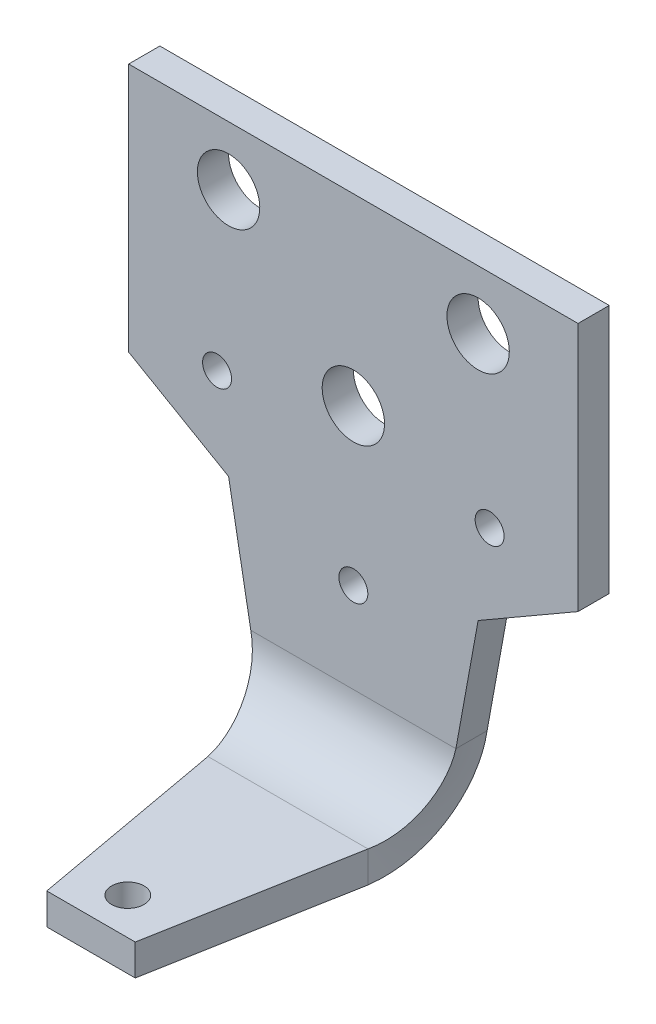
ISO-10303-21;
HEADER;
FILE_DESCRIPTION(('STEP AP214'),'2;1');
FILE_NAME('part.step','',(''),(''),'','','');
FILE_SCHEMA(('AUTOMOTIVE_DESIGN { 1 0 10303 214 1 1 1 1 }'));
ENDSEC;
DATA;
#1=APPLICATION_CONTEXT('core data for automotive mechanical design processes');
#2=APPLICATION_PROTOCOL_DEFINITION('international standard','automotive_design',2000,#1);
#3=PRODUCT_CONTEXT('',#1,'mechanical');
#4=PRODUCT('Part','Part','',(#3));
#5=PRODUCT_RELATED_PRODUCT_CATEGORY('part','',(#4));
#6=PRODUCT_DEFINITION_FORMATION('','',#4);
#7=PRODUCT_DEFINITION_CONTEXT('part definition',#1,'design');
#8=PRODUCT_DEFINITION('design','',#6,#7);
#9=PRODUCT_DEFINITION_SHAPE('','',#8);
#10=(LENGTH_UNIT() NAMED_UNIT(*) SI_UNIT(.MILLI.,.METRE.));
#11=(NAMED_UNIT(*) PLANE_ANGLE_UNIT() SI_UNIT($,.RADIAN.));
#12=(NAMED_UNIT(*) SI_UNIT($,.STERADIAN.) SOLID_ANGLE_UNIT());
#13=UNCERTAINTY_MEASURE_WITH_UNIT(LENGTH_MEASURE(1.E-05),#10,'distance_accuracy_value','');
#14=(GEOMETRIC_REPRESENTATION_CONTEXT(3) GLOBAL_UNCERTAINTY_ASSIGNED_CONTEXT((#13)) GLOBAL_UNIT_ASSIGNED_CONTEXT((#10,
#11,#12)) REPRESENTATION_CONTEXT('',''));
#15=CARTESIAN_POINT('',(0.,0.,0.));
#16=DIRECTION('',(0.,0.,1.));
#17=DIRECTION('',(1.,0.,0.));
#18=AXIS2_PLACEMENT_3D('',#15,#16,#17);
#19=CARTESIAN_POINT('',(1.09634523681734E-12,50.3558674596446,49.6441325403562));
#20=DIRECTION('',(0.,0.,-1.));
#21=DIRECTION('',(0.,1.,0.));
#22=AXIS2_PLACEMENT_3D('',#19,#20,#21);
#23=PLANE('',#22);
#24=CARTESIAN_POINT('',(10.170000000001,44.3558674596444,49.6441325403559));
#25=DIRECTION('',(0.,0.,1.));
#26=DIRECTION('',(0.,-1.,0.));
#27=AXIS2_PLACEMENT_3D('',#24,#25,#26);
#28=CIRCLE('',#27,3.175);
#29=CARTESIAN_POINT('',(10.1700000000009,41.1808674596444,49.6441325403559));
#30=VERTEX_POINT('',#29);
#31=EDGE_CURVE('E294',#30,#30,#28,.T.);
#32=ORIENTED_EDGE('',*,*,#31,.F.);
#33=EDGE_LOOP('',(#32));
#34=FACE_BOUND('',#33,.T.);
#35=CARTESIAN_POINT('',(35.570000000001,44.3558674596438,49.6441325403554));
#36=DIRECTION('',(0.,0.,1.));
#37=DIRECTION('',(0.,-1.,0.));
#38=AXIS2_PLACEMENT_3D('',#35,#36,#37);
#39=CIRCLE('',#38,3.17500000000001);
#40=CARTESIAN_POINT('',(35.5700000000009,41.1808674596438,49.6441325403554));
#41=VERTEX_POINT('',#40);
#42=EDGE_CURVE('E298',#41,#41,#39,.T.);
#43=ORIENTED_EDGE('',*,*,#42,.F.);
#44=EDGE_LOOP('',(#43));
#45=FACE_BOUND('',#44,.T.);
#46=CARTESIAN_POINT('',(22.8700000000007,31.6558674596441,49.6441325403556));
#47=DIRECTION('',(0.,0.,1.));
#48=DIRECTION('',(0.,-1.,0.));
#49=AXIS2_PLACEMENT_3D('',#46,#47,#48);
#50=CIRCLE('',#49,3.175);
#51=CARTESIAN_POINT('',(22.8700000000006,28.4808674596441,49.6441325403556));
#52=VERTEX_POINT('',#51);
#53=EDGE_CURVE('E302',#52,#52,#50,.T.);
#54=ORIENTED_EDGE('',*,*,#53,.F.);
#55=EDGE_LOOP('',(#54));
#56=FACE_BOUND('',#55,.T.);
#57=CARTESIAN_POINT('',(9.0000000000006,27.8308674596444,49.6441325403559));
#58=DIRECTION('',(0.,0.,1.));
#59=DIRECTION('',(0.,-1.,0.));
#60=AXIS2_PLACEMENT_3D('',#57,#58,#59);
#61=CIRCLE('',#60,1.4732);
#62=CARTESIAN_POINT('',(9.00000000000056,26.3576674596444,49.6441325403559));
#63=VERTEX_POINT('',#62);
#64=EDGE_CURVE('E306',#63,#63,#61,.T.);
#65=ORIENTED_EDGE('',*,*,#64,.F.);
#66=EDGE_LOOP('',(#65));
#67=FACE_BOUND('',#66,.T.);
#68=CARTESIAN_POINT('',(36.7400000000006,27.8308674596438,49.6441325403553));
#69=DIRECTION('',(0.,0.,1.));
#70=DIRECTION('',(0.,-1.,0.));
#71=AXIS2_PLACEMENT_3D('',#68,#69,#70);
#72=CIRCLE('',#71,1.4732);
#73=CARTESIAN_POINT('',(36.7400000000006,26.3576674596438,49.6441325403553));
#74=VERTEX_POINT('',#73);
#75=EDGE_CURVE('E310',#74,#74,#72,.T.);
#76=ORIENTED_EDGE('',*,*,#75,.F.);
#77=EDGE_LOOP('',(#76));
#78=FACE_BOUND('',#77,.T.);
#79=CARTESIAN_POINT('',(22.8700000000003,15.8308674596441,49.6441325403556));
#80=DIRECTION('',(0.,0.,1.));
#81=DIRECTION('',(0.,-1.,0.));
#82=AXIS2_PLACEMENT_3D('',#79,#80,#81);
#83=CIRCLE('',#82,1.4732);
#84=CARTESIAN_POINT('',(22.8700000000003,14.3576674596441,49.6441325403556));
#85=VERTEX_POINT('',#84);
#86=EDGE_CURVE('E313',#85,#85,#83,.T.);
#87=ORIENTED_EDGE('',*,*,#86,.F.);
#88=EDGE_LOOP('',(#87));
#89=FACE_BOUND('',#88,.T.);
#90=DIRECTION('',(0.178968609813662,-0.983854784356597,0.));
#91=VECTOR('',#90,1.);
#92=CARTESIAN_POINT('',(10.1700000000004,19.0842152219859,49.6441325403559));
#93=LINE('',#92,#91);
#94=CARTESIAN_POINT('',(10.1700000000004,19.0842152219859,49.6441325403559));
#95=VERTEX_POINT('',#94);
#96=CARTESIAN_POINT('',(12.430979159166,6.65480000000004,49.6441325403558));
#97=VERTEX_POINT('',#96);
#98=EDGE_CURVE('E82',#95,#97,#93,.T.);
#99=ORIENTED_EDGE('',*,*,#98,.T.);
#100=DIRECTION('',(1.,0.,0.));
#101=VECTOR('',#100,1.);
#102=CARTESIAN_POINT('',(1.05820389416241E-12,6.65480000000005,49.644132540356));
#103=LINE('',#102,#101);
#104=CARTESIAN_POINT('',(33.3090208408344,6.65480000000002,49.6441325403553));
#105=VERTEX_POINT('',#104);
#106=EDGE_CURVE('E75',#97,#105,#103,.T.);
#107=ORIENTED_EDGE('',*,*,#106,.T.);
#108=DIRECTION('',(0.178968609813706,0.983854784356589,0.));
#109=VECTOR('',#108,1.);
#110=CARTESIAN_POINT('',(27.3699999999994,-25.9941325403559,49.6441325403553));
#111=LINE('',#110,#109);
#112=CARTESIAN_POINT('',(35.5700000000004,19.0842152219854,49.6441325403553));
#113=VERTEX_POINT('',#112);
#114=EDGE_CURVE('E90',#105,#113,#111,.T.);
#115=ORIENTED_EDGE('',*,*,#114,.T.);
#116=DIRECTION('',(0.866025403784451,0.499999999999979,0.));
#117=VECTOR('',#116,1.);
#118=CARTESIAN_POINT('',(45.7400000000005,24.9558674596436,49.6441325403551));
#119=LINE('',#118,#117);
#120=CARTESIAN_POINT('',(45.7400000000005,24.9558674596436,49.6441325403551));
#121=VERTEX_POINT('',#120);
#122=EDGE_CURVE('E359',#113,#121,#119,.T.);
#123=ORIENTED_EDGE('',*,*,#122,.T.);
#124=DIRECTION('',(0.,1.,0.));
#125=VECTOR('',#124,1.);
#126=CARTESIAN_POINT('',(45.7400000000011,50.3558674596436,49.6441325403552));
#127=LINE('',#126,#125);
#128=CARTESIAN_POINT('',(45.7400000000011,50.3558674596436,49.6441325403552));
#129=VERTEX_POINT('',#128);
#130=EDGE_CURVE('E362',#121,#129,#127,.T.);
#131=ORIENTED_EDGE('',*,*,#130,.T.);
#132=DIRECTION('',(-1.,0.,0.));
#133=VECTOR('',#132,1.);
#134=CARTESIAN_POINT('',(1.09634523681734E-12,50.3558674596446,49.6441325403562));
#135=LINE('',#134,#133);
#136=CARTESIAN_POINT('',(1.09634523681734E-12,50.3558674596446,49.6441325403562));
#137=VERTEX_POINT('',#136);
#138=EDGE_CURVE('E365',#129,#137,#135,.T.);
#139=ORIENTED_EDGE('',*,*,#138,.T.);
#140=DIRECTION('',(0.,-1.,0.));
#141=VECTOR('',#140,1.);
#142=CARTESIAN_POINT('',(1.09634523681734E-12,50.3558674596446,49.6441325403562));
#143=LINE('',#142,#141);
#144=CARTESIAN_POINT('',(5.33902532446029E-13,24.9558674596446,49.6441325403561));
#145=VERTEX_POINT('',#144);
#146=EDGE_CURVE('E368',#137,#145,#143,.T.);
#147=ORIENTED_EDGE('',*,*,#146,.T.);
#148=DIRECTION('',(0.866025403784429,-0.500000000000017,0.));
#149=VECTOR('',#148,1.);
#150=CARTESIAN_POINT('',(5.33902532446029E-13,24.9558674596446,49.6441325403561));
#151=LINE('',#150,#149);
#152=EDGE_CURVE('E371',#145,#95,#151,.T.);
#153=ORIENTED_EDGE('',*,*,#152,.T.);
#154=EDGE_LOOP('',(#99,#107,#115,#123,#131,#139,#147,#153));
#155=FACE_BOUND('',#154,.T.);
#156=ADVANCED_FACE('F63',(#34,#45,#56,#67,#78,#89,#155),#23,.F.);
#157=CARTESIAN_POINT('',(10.1700000000003,19.0842152219859,46.4691325403559));
#158=DIRECTION('',(-0.983854784356597,-0.178968609813662,0.));
#159=DIRECTION('',(0.178968609813662,-0.983854784356597,0.));
#160=AXIS2_PLACEMENT_3D('',#157,#158,#159);
#161=PLANE('',#160);
#162=CARTESIAN_POINT('',(12.430979159166,6.6548,49.6441325403557));
#163=CARTESIAN_POINT('',(12.4309791591659,6.6548,46.4691325403558));
#164=B_SPLINE_CURVE_WITH_KNOTS('',1,(#162,#163),.UNSPECIFIED.,.F.,.F.,(2,2),(0.,1.),.UNSPECIFIED.);
#165=CARTESIAN_POINT('',(12.4309791591659,6.65480000000005,46.4691325403558));
#166=VERTEX_POINT('',#165);
#167=EDGE_CURVE('E12',#97,#166,#164,.T.);
#168=ORIENTED_EDGE('',*,*,#167,.F.);
#169=ORIENTED_EDGE('',*,*,#98,.F.);
#170=DIRECTION('',(0.,0.,1.));
#171=VECTOR('',#170,1.);
#172=CARTESIAN_POINT('',(10.1700000000003,19.0842152219859,46.4691325403559));
#173=LINE('',#172,#171);
#174=CARTESIAN_POINT('',(10.1700000000003,19.0842152219859,46.4691325403559));
#175=VERTEX_POINT('',#174);
#176=EDGE_CURVE('E373',#175,#95,#173,.T.);
#177=ORIENTED_EDGE('',*,*,#176,.F.);
#178=DIRECTION('',(0.178968609813662,-0.983854784356597,0.));
#179=VECTOR('',#178,1.);
#180=CARTESIAN_POINT('',(10.1700000000003,19.0842152219859,46.4691325403559));
#181=LINE('',#180,#179);
#182=EDGE_CURVE('E358',#175,#166,#181,.T.);
#183=ORIENTED_EDGE('',*,*,#182,.T.);
#184=EDGE_LOOP('',(#168,#169,#177,#183));
#185=FACE_BOUND('',#184,.T.);
#186=ADVANCED_FACE('F65',(#185),#161,.T.);
#187=CARTESIAN_POINT('',(4.63597194399615E-13,24.9558674596446,46.4691325403561));
#188=DIRECTION('',(-0.500000000000017,-0.866025403784429,0.));
#189=DIRECTION('',(0.866025403784429,-0.500000000000017,0.));
#190=AXIS2_PLACEMENT_3D('',#187,#188,#189);
#191=PLANE('',#190);
#192=ORIENTED_EDGE('',*,*,#152,.F.);
#193=DIRECTION('',(0.,0.,1.));
#194=VECTOR('',#193,1.);
#195=CARTESIAN_POINT('',(4.63597194399615E-13,24.9558674596446,46.4691325403561));
#196=LINE('',#195,#194);
#197=CARTESIAN_POINT('',(4.63597194399615E-13,24.9558674596446,46.4691325403561));
#198=VERTEX_POINT('',#197);
#199=EDGE_CURVE('E375',#198,#145,#196,.T.);
#200=ORIENTED_EDGE('',*,*,#199,.F.);
#201=DIRECTION('',(0.866025403784429,-0.500000000000017,0.));
#202=VECTOR('',#201,1.);
#203=CARTESIAN_POINT('',(4.63597194399615E-13,24.9558674596446,46.4691325403561));
#204=LINE('',#203,#202);
#205=EDGE_CURVE('E355',#198,#175,#204,.T.);
#206=ORIENTED_EDGE('',*,*,#205,.T.);
#207=ORIENTED_EDGE('',*,*,#176,.T.);
#208=EDGE_LOOP('',(#192,#200,#206,#207));
#209=FACE_BOUND('',#208,.T.);
#210=ADVANCED_FACE('F260',(#209),#191,.T.);
#211=CARTESIAN_POINT('',(1.02603989877093E-12,50.3558674596446,46.4691325403562));
#212=DIRECTION('',(-1.,0.,0.));
#213=DIRECTION('',(0.,-1.,0.));
#214=AXIS2_PLACEMENT_3D('',#211,#212,#213);
#215=PLANE('',#214);
#216=ORIENTED_EDGE('',*,*,#146,.F.);
#217=DIRECTION('',(0.,0.,1.));
#218=VECTOR('',#217,1.);
#219=CARTESIAN_POINT('',(1.02603989877093E-12,50.3558674596446,46.4691325403562));
#220=LINE('',#219,#218);
#221=CARTESIAN_POINT('',(1.02603989877093E-12,50.3558674596446,46.4691325403562));
#222=VERTEX_POINT('',#221);
#223=EDGE_CURVE('E377',#222,#137,#220,.T.);
#224=ORIENTED_EDGE('',*,*,#223,.F.);
#225=DIRECTION('',(0.,-1.,0.));
#226=VECTOR('',#225,1.);
#227=CARTESIAN_POINT('',(1.02603989877093E-12,50.3558674596446,46.4691325403562));
#228=LINE('',#227,#226);
#229=EDGE_CURVE('E352',#222,#198,#228,.T.);
#230=ORIENTED_EDGE('',*,*,#229,.T.);
#231=ORIENTED_EDGE('',*,*,#199,.T.);
#232=EDGE_LOOP('',(#216,#224,#230,#231));
#233=FACE_BOUND('',#232,.T.);
#234=ADVANCED_FACE('F263',(#233),#215,.T.);
#235=CARTESIAN_POINT('',(1.02603989877093E-12,50.3558674596446,46.4691325403562));
#236=DIRECTION('',(0.,1.,0.));
#237=DIRECTION('',(-1.,0.,0.));
#238=AXIS2_PLACEMENT_3D('',#235,#236,#237);
#239=PLANE('',#238);
#240=ORIENTED_EDGE('',*,*,#138,.F.);
#241=DIRECTION('',(0.,0.,1.));
#242=VECTOR('',#241,1.);
#243=CARTESIAN_POINT('',(45.740000000001,50.3558674596436,46.4691325403552));
#244=LINE('',#243,#242);
#245=CARTESIAN_POINT('',(45.740000000001,50.3558674596436,46.4691325403552));
#246=VERTEX_POINT('',#245);
#247=EDGE_CURVE('E379',#246,#129,#244,.T.);
#248=ORIENTED_EDGE('',*,*,#247,.F.);
#249=DIRECTION('',(-1.,0.,0.));
#250=VECTOR('',#249,1.);
#251=CARTESIAN_POINT('',(1.02603989877093E-12,50.3558674596446,46.4691325403562));
#252=LINE('',#251,#250);
#253=EDGE_CURVE('E349',#246,#222,#252,.T.);
#254=ORIENTED_EDGE('',*,*,#253,.T.);
#255=ORIENTED_EDGE('',*,*,#223,.T.);
#256=EDGE_LOOP('',(#240,#248,#254,#255));
#257=FACE_BOUND('',#256,.T.);
#258=ADVANCED_FACE('F267',(#257),#239,.T.);
#259=CARTESIAN_POINT('',(45.740000000001,50.3558674596436,46.4691325403552));
#260=DIRECTION('',(1.,0.,0.));
#261=DIRECTION('',(0.,1.,0.));
#262=AXIS2_PLACEMENT_3D('',#259,#260,#261);
#263=PLANE('',#262);
#264=ORIENTED_EDGE('',*,*,#130,.F.);
#265=DIRECTION('',(0.,0.,1.));
#266=VECTOR('',#265,1.);
#267=CARTESIAN_POINT('',(45.7400000000005,24.9558674596436,46.4691325403551));
#268=LINE('',#267,#266);
#269=CARTESIAN_POINT('',(45.7400000000005,24.9558674596436,46.4691325403551));
#270=VERTEX_POINT('',#269);
#271=EDGE_CURVE('E381',#270,#121,#268,.T.);
#272=ORIENTED_EDGE('',*,*,#271,.F.);
#273=DIRECTION('',(0.,1.,0.));
#274=VECTOR('',#273,1.);
#275=CARTESIAN_POINT('',(45.740000000001,50.3558674596436,46.4691325403552));
#276=LINE('',#275,#274);
#277=EDGE_CURVE('E345',#270,#246,#276,.T.);
#278=ORIENTED_EDGE('',*,*,#277,.T.);
#279=ORIENTED_EDGE('',*,*,#247,.T.);
#280=EDGE_LOOP('',(#264,#272,#278,#279));
#281=FACE_BOUND('',#280,.T.);
#282=ADVANCED_FACE('F271',(#281),#263,.T.);
#283=CARTESIAN_POINT('',(45.7400000000005,24.9558674596436,46.4691325403551));
#284=DIRECTION('',(0.499999999999979,-0.866025403784451,0.));
#285=DIRECTION('',(0.866025403784451,0.499999999999979,0.));
#286=AXIS2_PLACEMENT_3D('',#283,#284,#285);
#287=PLANE('',#286);
#288=ORIENTED_EDGE('',*,*,#122,.F.);
#289=DIRECTION('',(0.,0.,1.));
#290=VECTOR('',#289,1.);
#291=CARTESIAN_POINT('',(35.5700000000003,19.0842152219854,46.4691325403553));
#292=LINE('',#291,#290);
#293=CARTESIAN_POINT('',(35.5700000000003,19.0842152219854,46.4691325403553));
#294=VERTEX_POINT('',#293);
#295=EDGE_CURVE('E383',#294,#113,#292,.T.);
#296=ORIENTED_EDGE('',*,*,#295,.F.);
#297=DIRECTION('',(0.866025403784451,0.499999999999979,0.));
#298=VECTOR('',#297,1.);
#299=CARTESIAN_POINT('',(45.7400000000005,24.9558674596436,46.4691325403551));
#300=LINE('',#299,#298);
#301=EDGE_CURVE('E342',#294,#270,#300,.T.);
#302=ORIENTED_EDGE('',*,*,#301,.T.);
#303=ORIENTED_EDGE('',*,*,#271,.T.);
#304=EDGE_LOOP('',(#288,#296,#302,#303));
#305=FACE_BOUND('',#304,.T.);
#306=ADVANCED_FACE('F275',(#305),#287,.T.);
#307=CARTESIAN_POINT('',(27.3699999999993,-25.9941325403559,46.4691325403553));
#308=DIRECTION('',(0.983854784356589,-0.178968609813706,0.));
#309=DIRECTION('',(0.178968609813706,0.983854784356589,0.));
#310=AXIS2_PLACEMENT_3D('',#307,#308,#309);
#311=PLANE('',#310);
#312=CARTESIAN_POINT('',(33.3090208408343,6.6548,46.4691325403553));
#313=CARTESIAN_POINT('',(33.3090208408344,6.6548,49.6441325403553));
#314=B_SPLINE_CURVE_WITH_KNOTS('',1,(#312,#313),.UNSPECIFIED.,.F.,.F.,(2,2),(0.,1.),.UNSPECIFIED.);
#315=CARTESIAN_POINT('',(33.3090208408343,6.65480000000003,46.4691325403553));
#316=VERTEX_POINT('',#315);
#317=EDGE_CURVE('E389',#316,#105,#314,.T.);
#318=ORIENTED_EDGE('',*,*,#317,.F.);
#319=DIRECTION('',(0.178968609813706,0.983854784356589,0.));
#320=VECTOR('',#319,1.);
#321=CARTESIAN_POINT('',(27.3699999999993,-25.9941325403559,46.4691325403553));
#322=LINE('',#321,#320);
#323=EDGE_CURVE('E346',#316,#294,#322,.T.);
#324=ORIENTED_EDGE('',*,*,#323,.T.);
#325=ORIENTED_EDGE('',*,*,#295,.T.);
#326=ORIENTED_EDGE('',*,*,#114,.F.);
#327=EDGE_LOOP('',(#318,#324,#325,#326));
#328=FACE_BOUND('',#327,.T.);
#329=ADVANCED_FACE('F279',(#328),#311,.T.);
#330=CARTESIAN_POINT('',(1.02603989877093E-12,50.3558674596446,46.4691325403562));
#331=DIRECTION('',(0.,0.,-1.));
#332=DIRECTION('',(0.,1.,0.));
#333=AXIS2_PLACEMENT_3D('',#330,#331,#332);
#334=PLANE('',#333);
#335=DIRECTION('',(1.,0.,0.));
#336=VECTOR('',#335,1.);
#337=CARTESIAN_POINT('',(9.87898556115993E-13,6.65480000000006,46.469132540356));
#338=LINE('',#337,#336);
#339=EDGE_CURVE('E184',#166,#316,#338,.T.);
#340=ORIENTED_EDGE('',*,*,#339,.F.);
#341=ORIENTED_EDGE('',*,*,#182,.F.);
#342=ORIENTED_EDGE('',*,*,#205,.F.);
#343=ORIENTED_EDGE('',*,*,#229,.F.);
#344=ORIENTED_EDGE('',*,*,#253,.F.);
#345=ORIENTED_EDGE('',*,*,#277,.F.);
#346=ORIENTED_EDGE('',*,*,#301,.F.);
#347=ORIENTED_EDGE('',*,*,#323,.F.);
#348=EDGE_LOOP('',(#340,#341,#342,#343,#344,#345,#346,#347));
#349=FACE_BOUND('',#348,.T.);
#350=CARTESIAN_POINT('',(22.8700000000003,15.8308674596441,46.4691325403556));
#351=DIRECTION('',(0.,0.,1.));
#352=DIRECTION('',(0.,-1.,0.));
#353=AXIS2_PLACEMENT_3D('',#350,#351,#352);
#354=CIRCLE('',#353,1.4732);
#355=CARTESIAN_POINT('',(22.8700000000002,14.3576674596441,46.4691325403556));
#356=VERTEX_POINT('',#355);
#357=EDGE_CURVE('E315',#356,#356,#354,.T.);
#358=ORIENTED_EDGE('',*,*,#357,.T.);
#359=EDGE_LOOP('',(#358));
#360=FACE_BOUND('',#359,.T.);
#361=CARTESIAN_POINT('',(36.7400000000005,27.8308674596438,46.4691325403553));
#362=DIRECTION('',(0.,0.,1.));
#363=DIRECTION('',(0.,-1.,0.));
#364=AXIS2_PLACEMENT_3D('',#361,#362,#363);
#365=CIRCLE('',#364,1.4732);
#366=CARTESIAN_POINT('',(36.7400000000005,26.3576674596438,46.4691325403553));
#367=VERTEX_POINT('',#366);
#368=EDGE_CURVE('E322',#367,#367,#365,.T.);
#369=ORIENTED_EDGE('',*,*,#368,.T.);
#370=EDGE_LOOP('',(#369));
#371=FACE_BOUND('',#370,.T.);
#372=CARTESIAN_POINT('',(9.00000000000053,27.8308674596444,46.4691325403559));
#373=DIRECTION('',(0.,0.,1.));
#374=DIRECTION('',(0.,-1.,0.));
#375=AXIS2_PLACEMENT_3D('',#372,#373,#374);
#376=CIRCLE('',#375,1.4732);
#377=CARTESIAN_POINT('',(9.00000000000049,26.3576674596444,46.4691325403559));
#378=VERTEX_POINT('',#377);
#379=EDGE_CURVE('E326',#378,#378,#376,.T.);
#380=ORIENTED_EDGE('',*,*,#379,.T.);
#381=EDGE_LOOP('',(#380));
#382=FACE_BOUND('',#381,.T.);
#383=CARTESIAN_POINT('',(22.8700000000006,31.6558674596441,46.4691325403556));
#384=DIRECTION('',(0.,0.,1.));
#385=DIRECTION('',(0.,-1.,0.));
#386=AXIS2_PLACEMENT_3D('',#383,#384,#385);
#387=CIRCLE('',#386,3.175);
#388=CARTESIAN_POINT('',(22.8700000000005,28.4808674596441,46.4691325403556));
#389=VERTEX_POINT('',#388);
#390=EDGE_CURVE('E330',#389,#389,#387,.T.);
#391=ORIENTED_EDGE('',*,*,#390,.T.);
#392=EDGE_LOOP('',(#391));
#393=FACE_BOUND('',#392,.T.);
#394=CARTESIAN_POINT('',(35.5700000000009,44.3558674596438,46.4691325403554));
#395=DIRECTION('',(0.,0.,1.));
#396=DIRECTION('',(0.,-1.,0.));
#397=AXIS2_PLACEMENT_3D('',#394,#395,#396);
#398=CIRCLE('',#397,3.17500000000001);
#399=CARTESIAN_POINT('',(35.5700000000008,41.1808674596438,46.4691325403554));
#400=VERTEX_POINT('',#399);
#401=EDGE_CURVE('E334',#400,#400,#398,.T.);
#402=ORIENTED_EDGE('',*,*,#401,.T.);
#403=EDGE_LOOP('',(#402));
#404=FACE_BOUND('',#403,.T.);
#405=CARTESIAN_POINT('',(10.1700000000009,44.3558674596444,46.4691325403559));
#406=DIRECTION('',(0.,0.,1.));
#407=DIRECTION('',(0.,-1.,0.));
#408=AXIS2_PLACEMENT_3D('',#405,#406,#407);
#409=CIRCLE('',#408,3.175);
#410=CARTESIAN_POINT('',(10.1700000000008,41.1808674596444,46.4691325403559));
#411=VERTEX_POINT('',#410);
#412=EDGE_CURVE('E338',#411,#411,#409,.T.);
#413=ORIENTED_EDGE('',*,*,#412,.T.);
#414=EDGE_LOOP('',(#413));
#415=FACE_BOUND('',#414,.T.);
#416=ADVANCED_FACE('F258',(#349,#360,#371,#382,#393,#404,#415),#334,.T.);
#417=CARTESIAN_POINT('',(10.1700000000009,44.3558674596444,46.4691325403559));
#418=DIRECTION('',(0.,0.,1.));
#419=DIRECTION('',(0.,-1.,0.));
#420=AXIS2_PLACEMENT_3D('',#417,#418,#419);
#421=CYLINDRICAL_SURFACE('',#420,3.175);
#422=ORIENTED_EDGE('',*,*,#412,.F.);
#423=EDGE_LOOP('',(#422));
#424=FACE_BOUND('',#423,.T.);
#425=ORIENTED_EDGE('',*,*,#31,.T.);
#426=EDGE_LOOP('',(#425));
#427=FACE_BOUND('',#426,.T.);
#428=ADVANCED_FACE('F254',(#424,#427),#421,.F.);
#429=CARTESIAN_POINT('',(35.5700000000009,44.3558674596438,46.4691325403554));
#430=DIRECTION('',(0.,0.,1.));
#431=DIRECTION('',(0.,-1.,0.));
#432=AXIS2_PLACEMENT_3D('',#429,#430,#431);
#433=CYLINDRICAL_SURFACE('',#432,3.17500000000001);
#434=ORIENTED_EDGE('',*,*,#401,.F.);
#435=EDGE_LOOP('',(#434));
#436=FACE_BOUND('',#435,.T.);
#437=ORIENTED_EDGE('',*,*,#42,.T.);
#438=EDGE_LOOP('',(#437));
#439=FACE_BOUND('',#438,.T.);
#440=ADVANCED_FACE('F250',(#436,#439),#433,.F.);
#441=CARTESIAN_POINT('',(22.8700000000006,31.6558674596441,46.4691325403556));
#442=DIRECTION('',(0.,0.,1.));
#443=DIRECTION('',(0.,-1.,0.));
#444=AXIS2_PLACEMENT_3D('',#441,#442,#443);
#445=CYLINDRICAL_SURFACE('',#444,3.175);
#446=ORIENTED_EDGE('',*,*,#390,.F.);
#447=EDGE_LOOP('',(#446));
#448=FACE_BOUND('',#447,.T.);
#449=ORIENTED_EDGE('',*,*,#53,.T.);
#450=EDGE_LOOP('',(#449));
#451=FACE_BOUND('',#450,.T.);
#452=ADVANCED_FACE('F246',(#448,#451),#445,.F.);
#453=CARTESIAN_POINT('',(9.00000000000053,27.8308674596444,46.4691325403559));
#454=DIRECTION('',(0.,0.,1.));
#455=DIRECTION('',(0.,-1.,0.));
#456=AXIS2_PLACEMENT_3D('',#453,#454,#455);
#457=CYLINDRICAL_SURFACE('',#456,1.4732);
#458=ORIENTED_EDGE('',*,*,#379,.F.);
#459=EDGE_LOOP('',(#458));
#460=FACE_BOUND('',#459,.T.);
#461=ORIENTED_EDGE('',*,*,#64,.T.);
#462=EDGE_LOOP('',(#461));
#463=FACE_BOUND('',#462,.T.);
#464=ADVANCED_FACE('F242',(#460,#463),#457,.F.);
#465=CARTESIAN_POINT('',(36.7400000000005,27.8308674596438,46.4691325403553));
#466=DIRECTION('',(0.,0.,1.));
#467=DIRECTION('',(0.,-1.,0.));
#468=AXIS2_PLACEMENT_3D('',#465,#466,#467);
#469=CYLINDRICAL_SURFACE('',#468,1.4732);
#470=ORIENTED_EDGE('',*,*,#368,.F.);
#471=EDGE_LOOP('',(#470));
#472=FACE_BOUND('',#471,.T.);
#473=ORIENTED_EDGE('',*,*,#75,.T.);
#474=EDGE_LOOP('',(#473));
#475=FACE_BOUND('',#474,.T.);
#476=ADVANCED_FACE('F238',(#472,#475),#469,.F.);
#477=CARTESIAN_POINT('',(22.8700000000003,15.8308674596441,46.4691325403556));
#478=DIRECTION('',(0.,0.,1.));
#479=DIRECTION('',(0.,-1.,0.));
#480=AXIS2_PLACEMENT_3D('',#477,#478,#479);
#481=CYLINDRICAL_SURFACE('',#480,1.4732);
#482=ORIENTED_EDGE('',*,*,#357,.F.);
#483=EDGE_LOOP('',(#482));
#484=FACE_BOUND('',#483,.T.);
#485=ORIENTED_EDGE('',*,*,#86,.T.);
#486=EDGE_LOOP('',(#485));
#487=FACE_BOUND('',#486,.T.);
#488=ADVANCED_FACE('F234',(#484,#487),#481,.F.);
#489=CARTESIAN_POINT('',(18.37,-3.175,76.3499999999999));
#490=DIRECTION('',(0.,0.,1.));
#491=DIRECTION('',(1.,0.,0.));
#492=AXIS2_PLACEMENT_3D('',#489,#490,#491);
#493=PLANE('',#492);
#494=DIRECTION('',(1.,0.,0.));
#495=VECTOR('',#494,1.);
#496=CARTESIAN_POINT('',(18.37,0.,76.3499999999999));
#497=LINE('',#496,#495);
#498=CARTESIAN_POINT('',(18.37,0.,76.3499999999999));
#499=VERTEX_POINT('',#498);
#500=CARTESIAN_POINT('',(27.37,0.,76.3499999999999));
#501=VERTEX_POINT('',#500);
#502=EDGE_CURVE('E534',#499,#501,#497,.T.);
#503=ORIENTED_EDGE('',*,*,#502,.F.);
#504=DIRECTION('',(0.,1.,0.));
#505=VECTOR('',#504,1.);
#506=CARTESIAN_POINT('',(18.37,-3.175,76.3499999999999));
#507=LINE('',#506,#505);
#508=CARTESIAN_POINT('',(18.37,-3.175,76.3499999999999));
#509=VERTEX_POINT('',#508);
#510=EDGE_CURVE('E209',#509,#499,#507,.T.);
#511=ORIENTED_EDGE('',*,*,#510,.F.);
#512=DIRECTION('',(1.,0.,0.));
#513=VECTOR('',#512,1.);
#514=CARTESIAN_POINT('',(18.37,-3.175,76.3499999999999));
#515=LINE('',#514,#513);
#516=CARTESIAN_POINT('',(27.37,-3.175,76.3499999999999));
#517=VERTEX_POINT('',#516);
#518=EDGE_CURVE('E544',#509,#517,#515,.T.);
#519=ORIENTED_EDGE('',*,*,#518,.T.);
#520=DIRECTION('',(0.,1.,0.));
#521=VECTOR('',#520,1.);
#522=CARTESIAN_POINT('',(27.37,-3.175,76.3499999999999));
#523=LINE('',#522,#521);
#524=EDGE_CURVE('E201',#517,#501,#523,.T.);
#525=ORIENTED_EDGE('',*,*,#524,.T.);
#526=EDGE_LOOP('',(#503,#511,#519,#525));
#527=FACE_BOUND('',#526,.T.);
#528=ADVANCED_FACE('F237',(#527),#493,.T.);
#529=CARTESIAN_POINT('',(22.87,-3.175,72.6));
#530=DIRECTION('',(0.,1.,0.));
#531=DIRECTION('',(0.,0.,1.));
#532=AXIS2_PLACEMENT_3D('',#529,#530,#531);
#533=CYLINDRICAL_SURFACE('',#532,1.65);
#534=CARTESIAN_POINT('',(22.87,-3.175,72.6));
#535=DIRECTION('',(0.,1.,0.));
#536=DIRECTION('',(0.,0.,1.));
#537=AXIS2_PLACEMENT_3D('',#534,#535,#536);
#538=CIRCLE('',#537,1.65);
#539=CARTESIAN_POINT('',(22.87,-3.175,74.25));
#540=VERTEX_POINT('',#539);
#541=EDGE_CURVE('E198',#540,#540,#538,.T.);
#542=ORIENTED_EDGE('',*,*,#541,.F.);
#543=EDGE_LOOP('',(#542));
#544=FACE_BOUND('',#543,.T.);
#545=CARTESIAN_POINT('',(22.87,0.,72.6));
#546=DIRECTION('',(0.,1.,0.));
#547=DIRECTION('',(0.,0.,1.));
#548=AXIS2_PLACEMENT_3D('',#545,#546,#547);
#549=CIRCLE('',#548,1.65);
#550=CARTESIAN_POINT('',(22.87,0.,74.25));
#551=VERTEX_POINT('',#550);
#552=EDGE_CURVE('E540',#551,#551,#549,.T.);
#553=ORIENTED_EDGE('',*,*,#552,.T.);
#554=EDGE_LOOP('',(#553));
#555=FACE_BOUND('',#554,.T.);
#556=ADVANCED_FACE('F564',(#544,#555),#533,.F.);
#557=CARTESIAN_POINT('',(0.,-3.175,0.));
#558=DIRECTION('',(0.,-1.,0.));
#559=DIRECTION('',(0.,0.,-1.));
#560=AXIS2_PLACEMENT_3D('',#557,#558,#559);
#561=PLANE('',#560);
#562=ORIENTED_EDGE('',*,*,#541,.T.);
#563=EDGE_LOOP('',(#562));
#564=FACE_BOUND('',#563,.T.);
#565=DIRECTION('',(0.178968609813684,0.,0.983854784356593));
#566=VECTOR('',#565,1.);
#567=CARTESIAN_POINT('',(10.17,-3.175,31.2716522376585));
#568=LINE('',#567,#566);
#569=CARTESIAN_POINT('',(14.7226002763917,-3.175,56.2989325403557));
#570=VERTEX_POINT('',#569);
#571=EDGE_CURVE('E196',#570,#509,#568,.T.);
#572=ORIENTED_EDGE('',*,*,#571,.F.);
#573=DIRECTION('',(1.,0.,0.));
#574=VECTOR('',#573,1.);
#575=CARTESIAN_POINT('',(1.24665054611086E-12,-3.175,56.298932540356));
#576=LINE('',#575,#574);
#577=CARTESIAN_POINT('',(31.0173997236084,-3.175,56.2989325403553));
#578=VERTEX_POINT('',#577);
#579=EDGE_CURVE('E182',#570,#578,#576,.T.);
#580=ORIENTED_EDGE('',*,*,#579,.T.);
#581=DIRECTION('',(0.178968609813684,0.,-0.983854784356593));
#582=VECTOR('',#581,1.);
#583=CARTESIAN_POINT('',(27.37,-3.175,76.3499999999999));
#584=LINE('',#583,#582);
#585=EDGE_CURVE('E173',#517,#578,#584,.T.);
#586=ORIENTED_EDGE('',*,*,#585,.F.);
#587=ORIENTED_EDGE('',*,*,#518,.F.);
#588=EDGE_LOOP('',(#572,#580,#586,#587));
#589=FACE_BOUND('',#588,.T.);
#590=ADVANCED_FACE('F193',(#564,#589),#561,.T.);
#591=CARTESIAN_POINT('',(27.37,-3.175,76.3499999999999));
#592=DIRECTION('',(0.983854784356593,0.,0.178968609813684));
#593=DIRECTION('',(0.178968609813684,0.,-0.983854784356593));
#594=AXIS2_PLACEMENT_3D('',#591,#592,#593);
#595=PLANE('',#594);
#596=ORIENTED_EDGE('',*,*,#585,.T.);
#597=CARTESIAN_POINT('',(31.0173997236084,0.,56.2989325403553));
#598=CARTESIAN_POINT('',(31.0173997236084,-3.175,56.2989325403553));
#599=B_SPLINE_CURVE_WITH_KNOTS('',1,(#597,#598),.UNSPECIFIED.,.F.,.F.,(2,2),(0.,1.),.UNSPECIFIED.);
#600=CARTESIAN_POINT('',(31.0173997236084,0.,56.2989325403553));
#601=VERTEX_POINT('',#600);
#602=EDGE_CURVE('E157',#578,#601,#599,.F.);
#603=ORIENTED_EDGE('',*,*,#602,.T.);
#604=DIRECTION('',(0.178968609813684,0.,-0.983854784356593));
#605=VECTOR('',#604,1.);
#606=CARTESIAN_POINT('',(27.37,0.,76.3499999999999));
#607=LINE('',#606,#605);
#608=EDGE_CURVE('E537',#501,#601,#607,.T.);
#609=ORIENTED_EDGE('',*,*,#608,.F.);
#610=ORIENTED_EDGE('',*,*,#524,.F.);
#611=EDGE_LOOP('',(#596,#603,#609,#610));
#612=FACE_BOUND('',#611,.T.);
#613=ADVANCED_FACE('F200',(#612),#595,.T.);
#614=CARTESIAN_POINT('',(0.,0.,0.));
#615=DIRECTION('',(0.,-1.,0.));
#616=DIRECTION('',(0.,0.,-1.));
#617=AXIS2_PLACEMENT_3D('',#614,#615,#616);
#618=PLANE('',#617);
#619=DIRECTION('',(1.,0.,0.));
#620=VECTOR('',#619,1.);
#621=CARTESIAN_POINT('',(1.24665054611086E-12,0.,56.298932540356));
#622=LINE('',#621,#620);
#623=CARTESIAN_POINT('',(14.7226002763917,0.,56.2989325403557));
#624=VERTEX_POINT('',#623);
#625=EDGE_CURVE('E186',#624,#601,#622,.T.);
#626=ORIENTED_EDGE('',*,*,#625,.F.);
#627=DIRECTION('',(0.178968609813684,0.,0.983854784356593));
#628=VECTOR('',#627,1.);
#629=CARTESIAN_POINT('',(10.17,0.,31.2716522376585));
#630=LINE('',#629,#628);
#631=EDGE_CURVE('E172',#624,#499,#630,.T.);
#632=ORIENTED_EDGE('',*,*,#631,.T.);
#633=ORIENTED_EDGE('',*,*,#502,.T.);
#634=ORIENTED_EDGE('',*,*,#608,.T.);
#635=EDGE_LOOP('',(#626,#632,#633,#634));
#636=FACE_BOUND('',#635,.T.);
#637=ORIENTED_EDGE('',*,*,#552,.F.);
#638=EDGE_LOOP('',(#637));
#639=FACE_BOUND('',#638,.T.);
#640=ADVANCED_FACE('F232',(#636,#639),#618,.F.);
#641=CARTESIAN_POINT('',(10.17,-3.175,31.2716522376585));
#642=DIRECTION('',(-0.983854784356593,0.,0.178968609813684));
#643=DIRECTION('',(0.178968609813684,0.,0.983854784356593));
#644=AXIS2_PLACEMENT_3D('',#641,#642,#643);
#645=PLANE('',#644);
#646=ORIENTED_EDGE('',*,*,#631,.F.);
#647=CARTESIAN_POINT('',(14.7226002763917,-3.175,56.2989325403557));
#648=CARTESIAN_POINT('',(14.7226002763917,0.,56.2989325403557));
#649=B_SPLINE_CURVE_WITH_KNOTS('',1,(#647,#648),.UNSPECIFIED.,.F.,.F.,(2,2),(0.,1.),.UNSPECIFIED.);
#650=EDGE_CURVE('E210',#624,#570,#649,.F.);
#651=ORIENTED_EDGE('',*,*,#650,.T.);
#652=ORIENTED_EDGE('',*,*,#571,.T.);
#653=ORIENTED_EDGE('',*,*,#510,.T.);
#654=EDGE_LOOP('',(#646,#651,#652,#653));
#655=FACE_BOUND('',#654,.T.);
#656=ADVANCED_FACE('F221',(#655),#645,.T.);
#657=CARTESIAN_POINT('',(14.7226002763917,-3.175,56.2989325403557));
#658=CARTESIAN_POINT('',(14.5315981609389,-3.175,55.0119877375049));
#659=CARTESIAN_POINT('',(14.3406634235207,-2.91915661711421,53.7260031866809));
#660=CARTESIAN_POINT('',(13.9587265706497,-1.93434544024469,51.3484586871059));
#661=CARTESIAN_POINT('',(13.7677581442143,-1.20576512740564,50.2580611923463));
#662=CARTESIAN_POINT('',(13.3858212913433,0.613928651990574,48.4383674129501));
#663=CARTESIAN_POINT('',(13.1948528649078,1.70432614675013,47.7097871001111));
#664=CARTESIAN_POINT('',(12.8129160120368,4.08187064632514,46.7249759232415));
#665=CARTESIAN_POINT('',(12.6219812746187,5.36785519714911,46.4691325403557));
#666=CARTESIAN_POINT('',(12.4309791591659,6.6548,46.4691325403558));
#667=CARTESIAN_POINT('',(14.7226002763917,0.,56.2989325403557));
#668=CARTESIAN_POINT('',(14.5315989977187,0.,55.4276714003967));
#669=CARTESIAN_POINT('',(14.3406634235208,0.17320663130769,54.5570527195216));
#670=CARTESIAN_POINT('',(13.9587265706498,0.839926342780079,52.9474489497835));
#671=CARTESIAN_POINT('',(13.7677581442143,1.33317709720859,52.2092470282667));
#672=CARTESIAN_POINT('',(13.3858212913433,2.56511448791093,50.9773096375643));
#673=CARTESIAN_POINT('',(13.1948528649079,3.30331640942773,50.4840588831358));
#674=CARTESIAN_POINT('',(12.8129160120369,4.91292017916586,49.8173391716634));
#675=CARTESIAN_POINT('',(12.6219804378389,5.78353886004094,49.6441325403557));
#676=CARTESIAN_POINT('',(12.430979159166,6.6548,49.6441325403557));
#677=B_SPLINE_SURFACE_WITH_KNOTS('',1,3,((#657,#658,#659,#660,#661,#662,#663,#664,#665,#666),
(#667,#668,#669,#670,#671,#672,#673,#674,#675,#676)),.UNSPECIFIED.,.F.,.F.,.F.,(2,2),(4,2,2,2,
4),(0.,1.),(0.,0.25,0.5,0.75,1.),.UNSPECIFIED.);
#678=CARTESIAN_POINT('',(14.7226002763917,0.,56.2989325403557));
#679=CARTESIAN_POINT('',(14.5315989977187,0.,55.4276714003967));
#680=CARTESIAN_POINT('',(14.3406634235208,0.17320663130769,54.5570527195216));
#681=CARTESIAN_POINT('',(13.9587265706498,0.839926342780079,52.9474489497835));
#682=CARTESIAN_POINT('',(13.7677581442143,1.33317709720859,52.2092470282667));
#683=CARTESIAN_POINT('',(13.3858212913433,2.56511448791093,50.9773096375643));
#684=CARTESIAN_POINT('',(13.1948528649079,3.30331640942773,50.4840588831358));
#685=CARTESIAN_POINT('',(12.8129160120369,4.91292017916586,49.8173391716634));
#686=CARTESIAN_POINT('',(12.6219804378389,5.78353886004094,49.6441325403557));
#687=CARTESIAN_POINT('',(12.430979159166,6.6548,49.6441325403557));
#688=B_SPLINE_CURVE_WITH_KNOTS('',3,(#678,#679,#680,#681,#682,#683,#684,#685,#686,#687),
.UNSPECIFIED.,.F.,.F.,(4,2,2,2,4),(0.,0.25,0.5,0.75,1.),.UNSPECIFIED.);
#689=EDGE_CURVE('E428',#624,#97,#688,.T.);
#690=CARTESIAN_POINT('',(12.4309791591659,6.6548,46.4691325403558));
#691=CARTESIAN_POINT('',(12.6219812746187,5.36785519714911,46.4691325403557));
#692=CARTESIAN_POINT('',(12.8129160120368,4.08187064632514,46.7249759232415));
#693=CARTESIAN_POINT('',(13.1948528649078,1.70432614675013,47.7097871001111));
#694=CARTESIAN_POINT('',(13.3858212913433,0.613928651990574,48.4383674129501));
#695=CARTESIAN_POINT('',(13.7677581442143,-1.20576512740564,50.2580611923463));
#696=CARTESIAN_POINT('',(13.9587265706497,-1.93434544024469,51.3484586871059));
#697=CARTESIAN_POINT('',(14.3406634235207,-2.91915661711421,53.7260031866809));
#698=CARTESIAN_POINT('',(14.5315981609389,-3.175,55.0119877375049));
#699=CARTESIAN_POINT('',(14.7226002763917,-3.175,56.2989325403557));
#700=B_SPLINE_CURVE_WITH_KNOTS('',3,(#690,#691,#692,#693,#694,#695,#696,#697,#698,#699),
.UNSPECIFIED.,.F.,.F.,(4,2,2,2,4),(0.,0.25,0.5,0.75,1.),.UNSPECIFIED.);
#701=EDGE_CURVE('E187',#570,#166,#700,.F.);
#702=ORIENTED_EDGE('',*,*,#650,.F.);
#703=ORIENTED_EDGE('',*,*,#689,.T.);
#704=ORIENTED_EDGE('',*,*,#167,.T.);
#705=ORIENTED_EDGE('',*,*,#701,.F.);
#706=EDGE_LOOP('',(#702,#703,#704,#705));
#707=FACE_BOUND('',#706,.T.);
#708=ADVANCED_FACE('F231',(#707),#677,.T.);
#709=CARTESIAN_POINT('',(33.3090208408343,6.6548,46.4691325403553));
#710=CARTESIAN_POINT('',(33.1180187253815,5.36785519714912,46.4691325403553));
#711=CARTESIAN_POINT('',(32.9270839879633,4.08187064632514,46.7249759232411));
#712=CARTESIAN_POINT('',(32.5451471350923,1.70432614675013,47.7097871001106));
#713=CARTESIAN_POINT('',(32.3541787086568,0.61392865199058,48.4383674129497));
#714=CARTESIAN_POINT('',(31.9722418557858,-1.20576512740563,50.2580611923459));
#715=CARTESIAN_POINT('',(31.7812734293503,-1.93434544024468,51.3484586871055));
#716=CARTESIAN_POINT('',(31.3993365764793,-2.91915661711421,53.7260031866805));
#717=CARTESIAN_POINT('',(31.2084018390611,-3.175,55.0119877375045));
#718=CARTESIAN_POINT('',(31.0173997236084,-3.175,56.2989325403553));
#719=CARTESIAN_POINT('',(33.3090208408344,6.6548,49.6441325403553));
#720=CARTESIAN_POINT('',(33.1180195621614,5.78353886004093,49.6441325403553));
#721=CARTESIAN_POINT('',(32.9270839879633,4.91292017916586,49.817339171663));
#722=CARTESIAN_POINT('',(32.5451471350923,3.30331640942774,50.4840588831354));
#723=CARTESIAN_POINT('',(32.3541787086568,2.56511448791094,50.9773096375639));
#724=CARTESIAN_POINT('',(31.9722418557858,1.33317709720859,52.2092470282662));
#725=CARTESIAN_POINT('',(31.7812734293503,0.839926342780086,52.9474489497831));
#726=CARTESIAN_POINT('',(31.3993365764793,0.173206631307695,54.5570527195212));
#727=CARTESIAN_POINT('',(31.2084010022813,0.,55.4276714003963));
#728=CARTESIAN_POINT('',(31.0173997236084,0.,56.2989325403553));
#729=B_SPLINE_SURFACE_WITH_KNOTS('',1,3,((#709,#710,#711,#712,#713,#714,#715,#716,#717,#718),
(#719,#720,#721,#722,#723,#724,#725,#726,#727,#728)),.UNSPECIFIED.,.F.,.F.,.F.,(2,2),(4,2,2,2,
4),(0.,1.),(0.,0.25,0.5,0.75,1.),.UNSPECIFIED.);
#730=CARTESIAN_POINT('',(33.3090208408344,6.6548,49.6441325403553));
#731=CARTESIAN_POINT('',(33.1180195621614,5.78353886004093,49.6441325403553));
#732=CARTESIAN_POINT('',(32.9270839879633,4.91292017916586,49.817339171663));
#733=CARTESIAN_POINT('',(32.5451471350923,3.30331640942774,50.4840588831354));
#734=CARTESIAN_POINT('',(32.3541787086568,2.56511448791094,50.9773096375639));
#735=CARTESIAN_POINT('',(31.9722418557858,1.33317709720859,52.2092470282662));
#736=CARTESIAN_POINT('',(31.7812734293503,0.839926342780086,52.9474489497831));
#737=CARTESIAN_POINT('',(31.3993365764793,0.173206631307695,54.5570527195212));
#738=CARTESIAN_POINT('',(31.2084010022813,0.,55.4276714003963));
#739=CARTESIAN_POINT('',(31.0173997236084,0.,56.2989325403553));
#740=B_SPLINE_CURVE_WITH_KNOTS('',3,(#730,#731,#732,#733,#734,#735,#736,#737,#738,#739),
.UNSPECIFIED.,.F.,.F.,(4,2,2,2,4),(0.,0.25,0.5,0.75,1.),.UNSPECIFIED.);
#741=EDGE_CURVE('E165',#105,#601,#740,.T.);
#742=CARTESIAN_POINT('',(31.0173997236084,-3.175,56.2989325403553));
#743=CARTESIAN_POINT('',(31.2084018390611,-3.175,55.0119877375045));
#744=CARTESIAN_POINT('',(31.3993365764793,-2.91915661711421,53.7260031866805));
#745=CARTESIAN_POINT('',(31.7812734293503,-1.93434544024468,51.3484586871055));
#746=CARTESIAN_POINT('',(31.9722418557858,-1.20576512740563,50.2580611923459));
#747=CARTESIAN_POINT('',(32.3541787086568,0.61392865199058,48.4383674129497));
#748=CARTESIAN_POINT('',(32.5451471350923,1.70432614675013,47.7097871001106));
#749=CARTESIAN_POINT('',(32.9270839879633,4.08187064632514,46.7249759232411));
#750=CARTESIAN_POINT('',(33.1180187253815,5.36785519714912,46.4691325403553));
#751=CARTESIAN_POINT('',(33.3090208408343,6.6548,46.4691325403553));
#752=B_SPLINE_CURVE_WITH_KNOTS('',3,(#742,#743,#744,#745,#746,#747,#748,#749,#750,#751),
.UNSPECIFIED.,.F.,.F.,(4,2,2,2,4),(0.,0.25,0.5,0.75,1.),.UNSPECIFIED.);
#753=EDGE_CURVE('E162',#316,#578,#752,.F.);
#754=ORIENTED_EDGE('',*,*,#741,.T.);
#755=ORIENTED_EDGE('',*,*,#602,.F.);
#756=ORIENTED_EDGE('',*,*,#753,.F.);
#757=ORIENTED_EDGE('',*,*,#317,.T.);
#758=EDGE_LOOP('',(#754,#755,#756,#757));
#759=FACE_BOUND('',#758,.T.);
#760=ADVANCED_FACE('F160',(#759),#729,.T.);
#761=CARTESIAN_POINT('',(-1.72023086620579,6.6548,56.2989325403561));
#762=DIRECTION('',(1.,0.,0.));
#763=DIRECTION('',(0.,0.,-1.));
#764=AXIS2_PLACEMENT_3D('',#761,#762,#763);
#765=CYLINDRICAL_SURFACE('',#764,9.8298);
#766=ORIENTED_EDGE('',*,*,#339,.T.);
#767=ORIENTED_EDGE('',*,*,#753,.T.);
#768=ORIENTED_EDGE('',*,*,#579,.F.);
#769=ORIENTED_EDGE('',*,*,#701,.T.);
#770=EDGE_LOOP('',(#766,#767,#768,#769));
#771=FACE_BOUND('',#770,.T.);
#772=ADVANCED_FACE('F180',(#771),#765,.T.);
#773=CARTESIAN_POINT('',(-1.72023086620579,6.6548,56.2989325403561));
#774=DIRECTION('',(1.,0.,0.));
#775=DIRECTION('',(0.,0.,-1.));
#776=AXIS2_PLACEMENT_3D('',#773,#774,#775);
#777=CYLINDRICAL_SURFACE('',#776,6.6548);
#778=ORIENTED_EDGE('',*,*,#106,.F.);
#779=ORIENTED_EDGE('',*,*,#689,.F.);
#780=ORIENTED_EDGE('',*,*,#625,.T.);
#781=ORIENTED_EDGE('',*,*,#741,.F.);
#782=EDGE_LOOP('',(#778,#779,#780,#781));
#783=FACE_BOUND('',#782,.T.);
#784=ADVANCED_FACE('F427',(#783),#777,.F.);
#785=CLOSED_SHELL('',(#156,#186,#210,#234,#258,#282,#306,#329,#416,#428,#440,#452,#464,#476,
#488,#528,#556,#590,#613,#640,#656,#708,#760,#772,#784));
#786=MANIFOLD_SOLID_BREP('B2',#785);
#787=ADVANCED_BREP_SHAPE_REPRESENTATION('',(#18,#786),#14);
#788=SHAPE_DEFINITION_REPRESENTATION(#9,#787);
ENDSEC;
END-ISO-10303-21;
